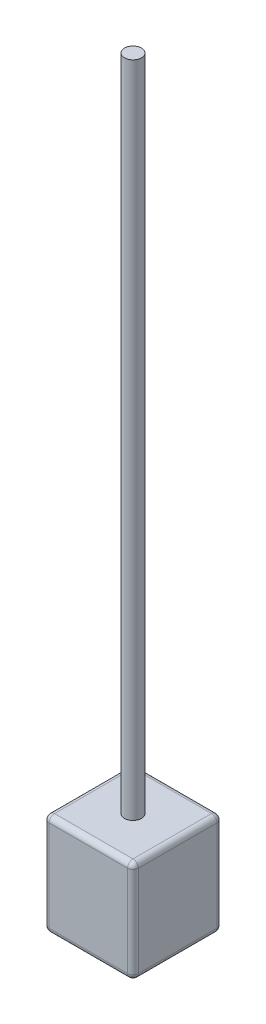
ISO-10303-21;
HEADER;
FILE_DESCRIPTION(('STEP AP214'),'2;1');
FILE_NAME('part.step','',(''),(''),'','','');
FILE_SCHEMA(('AUTOMOTIVE_DESIGN { 1 0 10303 214 1 1 1 1 }'));
ENDSEC;
DATA;
#1=APPLICATION_CONTEXT('core data for automotive mechanical design processes');
#2=APPLICATION_PROTOCOL_DEFINITION('international standard','automotive_design',2000,#1);
#3=PRODUCT_CONTEXT('',#1,'mechanical');
#4=PRODUCT('Part','Part','',(#3));
#5=PRODUCT_RELATED_PRODUCT_CATEGORY('part','',(#4));
#6=PRODUCT_DEFINITION_FORMATION('','',#4);
#7=PRODUCT_DEFINITION_CONTEXT('part definition',#1,'design');
#8=PRODUCT_DEFINITION('design','',#6,#7);
#9=PRODUCT_DEFINITION_SHAPE('','',#8);
#10=(LENGTH_UNIT() NAMED_UNIT(*) SI_UNIT(.MILLI.,.METRE.));
#11=(NAMED_UNIT(*) PLANE_ANGLE_UNIT() SI_UNIT($,.RADIAN.));
#12=(NAMED_UNIT(*) SI_UNIT($,.STERADIAN.) SOLID_ANGLE_UNIT());
#13=UNCERTAINTY_MEASURE_WITH_UNIT(LENGTH_MEASURE(1.E-05),#10,'distance_accuracy_value','');
#14=(GEOMETRIC_REPRESENTATION_CONTEXT(3) GLOBAL_UNCERTAINTY_ASSIGNED_CONTEXT((#13)) GLOBAL_UNIT_ASSIGNED_CONTEXT((#10,
#11,#12)) REPRESENTATION_CONTEXT('',''));
#15=CARTESIAN_POINT('',(0.,0.,0.));
#16=DIRECTION('',(0.,0.,1.));
#17=DIRECTION('',(1.,0.,0.));
#18=AXIS2_PLACEMENT_3D('',#15,#16,#17);
#19=CARTESIAN_POINT('',(21.,48.,21.));
#20=DIRECTION('',(-1.,0.,0.));
#21=DIRECTION('',(0.,0.,1.));
#22=AXIS2_PLACEMENT_3D('',#19,#20,#21);
#23=PLANE('',#22);
#24=DIRECTION('',(0.,-1.,0.));
#25=VECTOR('',#24,1.);
#26=CARTESIAN_POINT('',(21.,48.,18.46));
#27=LINE('',#26,#25);
#28=CARTESIAN_POINT('',(21.,45.46,18.46));
#29=VERTEX_POINT('',#28);
#30=CARTESIAN_POINT('',(21.,2.54,18.46));
#31=VERTEX_POINT('',#30);
#32=EDGE_CURVE('E186',#29,#31,#27,.T.);
#33=ORIENTED_EDGE('',*,*,#32,.T.);
#34=DIRECTION('',(0.,0.,-1.));
#35=VECTOR('',#34,1.);
#36=CARTESIAN_POINT('',(21.,2.54,-21.));
#37=LINE('',#36,#35);
#38=CARTESIAN_POINT('',(21.,2.54,-18.46));
#39=VERTEX_POINT('',#38);
#40=EDGE_CURVE('E190',#31,#39,#37,.T.);
#41=ORIENTED_EDGE('',*,*,#40,.T.);
#42=DIRECTION('',(0.,-1.,0.));
#43=VECTOR('',#42,1.);
#44=CARTESIAN_POINT('',(21.,48.,-18.46));
#45=LINE('',#44,#43);
#46=CARTESIAN_POINT('',(21.,45.46,-18.46));
#47=VERTEX_POINT('',#46);
#48=EDGE_CURVE('E188',#39,#47,#45,.F.);
#49=ORIENTED_EDGE('',*,*,#48,.T.);
#50=DIRECTION('',(0.,0.,-1.));
#51=VECTOR('',#50,1.);
#52=CARTESIAN_POINT('',(21.,45.46,21.));
#53=LINE('',#52,#51);
#54=EDGE_CURVE('E184',#47,#29,#53,.F.);
#55=ORIENTED_EDGE('',*,*,#54,.T.);
#56=EDGE_LOOP('',(#33,#41,#49,#55));
#57=FACE_BOUND('',#56,.T.);
#58=ADVANCED_FACE('F32',(#57),#23,.F.);
#59=CARTESIAN_POINT('',(-21.,48.,-21.));
#60=DIRECTION('',(0.,0.,1.));
#61=DIRECTION('',(1.,0.,0.));
#62=AXIS2_PLACEMENT_3D('',#59,#60,#61);
#63=PLANE('',#62);
#64=DIRECTION('',(-1.,0.,0.));
#65=VECTOR('',#64,1.);
#66=CARTESIAN_POINT('',(-21.,2.54,-21.));
#67=LINE('',#66,#65);
#68=CARTESIAN_POINT('',(18.46,2.54,-21.));
#69=VERTEX_POINT('',#68);
#70=CARTESIAN_POINT('',(-18.46,2.54,-21.));
#71=VERTEX_POINT('',#70);
#72=EDGE_CURVE('E170',#69,#71,#67,.T.);
#73=ORIENTED_EDGE('',*,*,#72,.T.);
#74=DIRECTION('',(0.,-1.,0.));
#75=VECTOR('',#74,1.);
#76=CARTESIAN_POINT('',(-18.46,48.,-21.));
#77=LINE('',#76,#75);
#78=CARTESIAN_POINT('',(-18.46,45.46,-21.));
#79=VERTEX_POINT('',#78);
#80=EDGE_CURVE('E172',#71,#79,#77,.F.);
#81=ORIENTED_EDGE('',*,*,#80,.T.);
#82=DIRECTION('',(-1.,0.,0.));
#83=VECTOR('',#82,1.);
#84=CARTESIAN_POINT('',(-21.,45.46,-21.));
#85=LINE('',#84,#83);
#86=CARTESIAN_POINT('',(18.46,45.46,-21.));
#87=VERTEX_POINT('',#86);
#88=EDGE_CURVE('E166',#79,#87,#85,.F.);
#89=ORIENTED_EDGE('',*,*,#88,.T.);
#90=DIRECTION('',(0.,-1.,0.));
#91=VECTOR('',#90,1.);
#92=CARTESIAN_POINT('',(18.46,48.,-21.));
#93=LINE('',#92,#91);
#94=EDGE_CURVE('E168',#87,#69,#93,.T.);
#95=ORIENTED_EDGE('',*,*,#94,.T.);
#96=EDGE_LOOP('',(#73,#81,#89,#95));
#97=FACE_BOUND('',#96,.T.);
#98=ADVANCED_FACE('F288',(#97),#63,.F.);
#99=CARTESIAN_POINT('',(-21.,48.,21.));
#100=DIRECTION('',(1.,0.,0.));
#101=DIRECTION('',(0.,0.,-1.));
#102=AXIS2_PLACEMENT_3D('',#99,#100,#101);
#103=PLANE('',#102);
#104=DIRECTION('',(0.,0.,1.));
#105=VECTOR('',#104,1.);
#106=CARTESIAN_POINT('',(-21.,45.46,21.));
#107=LINE('',#106,#105);
#108=CARTESIAN_POINT('',(-21.,45.46,18.46));
#109=VERTEX_POINT('',#108);
#110=CARTESIAN_POINT('',(-21.,45.46,-18.46));
#111=VERTEX_POINT('',#110);
#112=EDGE_CURVE('E125',#109,#111,#107,.F.);
#113=ORIENTED_EDGE('',*,*,#112,.T.);
#114=DIRECTION('',(0.,-1.,0.));
#115=VECTOR('',#114,1.);
#116=CARTESIAN_POINT('',(-21.,48.,-18.46));
#117=LINE('',#116,#115);
#118=CARTESIAN_POINT('',(-21.,2.54,-18.46));
#119=VERTEX_POINT('',#118);
#120=EDGE_CURVE('E164',#111,#119,#117,.T.);
#121=ORIENTED_EDGE('',*,*,#120,.T.);
#122=DIRECTION('',(0.,0.,1.));
#123=VECTOR('',#122,1.);
#124=CARTESIAN_POINT('',(-21.,2.54,21.));
#125=LINE('',#124,#123);
#126=CARTESIAN_POINT('',(-21.,2.54,18.46));
#127=VERTEX_POINT('',#126);
#128=EDGE_CURVE('E128',#119,#127,#125,.T.);
#129=ORIENTED_EDGE('',*,*,#128,.T.);
#130=DIRECTION('',(0.,-1.,0.));
#131=VECTOR('',#130,1.);
#132=CARTESIAN_POINT('',(-21.,48.,18.46));
#133=LINE('',#132,#131);
#134=EDGE_CURVE('E120',#127,#109,#133,.F.);
#135=ORIENTED_EDGE('',*,*,#134,.T.);
#136=EDGE_LOOP('',(#113,#121,#129,#135));
#137=FACE_BOUND('',#136,.T.);
#138=ADVANCED_FACE('F122',(#137),#103,.F.);
#139=CARTESIAN_POINT('',(-21.,48.,21.));
#140=DIRECTION('',(0.,0.,-1.));
#141=DIRECTION('',(-1.,0.,0.));
#142=AXIS2_PLACEMENT_3D('',#139,#140,#141);
#143=PLANE('',#142);
#144=DIRECTION('',(0.,-1.,0.));
#145=VECTOR('',#144,1.);
#146=CARTESIAN_POINT('',(-18.46,48.,21.));
#147=LINE('',#146,#145);
#148=CARTESIAN_POINT('',(-18.46,45.46,21.));
#149=VERTEX_POINT('',#148);
#150=CARTESIAN_POINT('',(-18.46,2.54,21.));
#151=VERTEX_POINT('',#150);
#152=EDGE_CURVE('E138',#149,#151,#147,.T.);
#153=ORIENTED_EDGE('',*,*,#152,.T.);
#154=DIRECTION('',(1.,0.,0.));
#155=VECTOR('',#154,1.);
#156=CARTESIAN_POINT('',(21.,2.54,21.));
#157=LINE('',#156,#155);
#158=CARTESIAN_POINT('',(18.46,2.54,21.));
#159=VERTEX_POINT('',#158);
#160=EDGE_CURVE('E198',#151,#159,#157,.T.);
#161=ORIENTED_EDGE('',*,*,#160,.T.);
#162=DIRECTION('',(0.,-1.,0.));
#163=VECTOR('',#162,1.);
#164=CARTESIAN_POINT('',(18.46,48.,21.));
#165=LINE('',#164,#163);
#166=CARTESIAN_POINT('',(18.46,45.46,21.));
#167=VERTEX_POINT('',#166);
#168=EDGE_CURVE('E195',#159,#167,#165,.F.);
#169=ORIENTED_EDGE('',*,*,#168,.T.);
#170=DIRECTION('',(1.,0.,0.));
#171=VECTOR('',#170,1.);
#172=CARTESIAN_POINT('',(-21.,45.46,21.));
#173=LINE('',#172,#171);
#174=EDGE_CURVE('E193',#167,#149,#173,.F.);
#175=ORIENTED_EDGE('',*,*,#174,.T.);
#176=EDGE_LOOP('',(#153,#161,#169,#175));
#177=FACE_BOUND('',#176,.T.);
#178=ADVANCED_FACE('F277',(#177),#143,.F.);
#179=CARTESIAN_POINT('',(0.,48.,0.));
#180=DIRECTION('',(0.,-1.,0.));
#181=DIRECTION('',(0.,0.,-1.));
#182=AXIS2_PLACEMENT_3D('',#179,#180,#181);
#183=PLANE('',#182);
#184=DIRECTION('',(-1.,0.,0.));
#185=VECTOR('',#184,1.);
#186=CARTESIAN_POINT('',(0.,48.,-18.46));
#187=LINE('',#186,#185);
#188=CARTESIAN_POINT('',(18.46,48.,-18.46));
#189=VERTEX_POINT('',#188);
#190=CARTESIAN_POINT('',(-18.46,48.,-18.46));
#191=VERTEX_POINT('',#190);
#192=EDGE_CURVE('E41',#189,#191,#187,.T.);
#193=ORIENTED_EDGE('',*,*,#192,.T.);
#194=DIRECTION('',(0.,0.,1.));
#195=VECTOR('',#194,1.);
#196=CARTESIAN_POINT('',(-18.46,48.,0.));
#197=LINE('',#196,#195);
#198=CARTESIAN_POINT('',(-18.46,48.,18.46));
#199=VERTEX_POINT('',#198);
#200=EDGE_CURVE('E11',#191,#199,#197,.T.);
#201=ORIENTED_EDGE('',*,*,#200,.T.);
#202=DIRECTION('',(1.,0.,0.));
#203=VECTOR('',#202,1.);
#204=CARTESIAN_POINT('',(0.,48.,18.46));
#205=LINE('',#204,#203);
#206=CARTESIAN_POINT('',(18.46,48.,18.46));
#207=VERTEX_POINT('',#206);
#208=EDGE_CURVE('E201',#199,#207,#205,.T.);
#209=ORIENTED_EDGE('',*,*,#208,.T.);
#210=DIRECTION('',(0.,0.,-1.));
#211=VECTOR('',#210,1.);
#212=CARTESIAN_POINT('',(18.46,48.,0.));
#213=LINE('',#212,#211);
#214=EDGE_CURVE('E52',#207,#189,#213,.T.);
#215=ORIENTED_EDGE('',*,*,#214,.T.);
#216=EDGE_LOOP('',(#193,#201,#209,#215));
#217=FACE_BOUND('',#216,.T.);
#218=CARTESIAN_POINT('',(0.,48.,0.));
#219=DIRECTION('',(0.,-1.,0.));
#220=DIRECTION('',(0.,0.,-1.));
#221=AXIS2_PLACEMENT_3D('',#218,#219,#220);
#222=CIRCLE('',#221,4.);
#223=CARTESIAN_POINT('',(0.,48.,-4.));
#224=VERTEX_POINT('',#223);
#225=EDGE_CURVE('E156',#224,#224,#222,.F.);
#226=ORIENTED_EDGE('',*,*,#225,.F.);
#227=EDGE_LOOP('',(#226));
#228=FACE_BOUND('',#227,.T.);
#229=ADVANCED_FACE('F275',(#217,#228),#183,.F.);
#230=CARTESIAN_POINT('',(0.,0.,0.));
#231=DIRECTION('',(0.,-1.,0.));
#232=DIRECTION('',(0.,0.,-1.));
#233=AXIS2_PLACEMENT_3D('',#230,#231,#232);
#234=PLANE('',#233);
#235=DIRECTION('',(0.,0.,1.));
#236=VECTOR('',#235,1.);
#237=CARTESIAN_POINT('',(-18.46,0.,-21.));
#238=LINE('',#237,#236);
#239=CARTESIAN_POINT('',(-18.46,0.,18.46));
#240=VERTEX_POINT('',#239);
#241=CARTESIAN_POINT('',(-18.46,0.,-18.46));
#242=VERTEX_POINT('',#241);
#243=EDGE_CURVE('E179',#240,#242,#238,.F.);
#244=ORIENTED_EDGE('',*,*,#243,.T.);
#245=DIRECTION('',(-1.,0.,0.));
#246=VECTOR('',#245,1.);
#247=CARTESIAN_POINT('',(21.,0.,-18.46));
#248=LINE('',#247,#246);
#249=CARTESIAN_POINT('',(18.46,0.,-18.46));
#250=VERTEX_POINT('',#249);
#251=EDGE_CURVE('E181',#242,#250,#248,.F.);
#252=ORIENTED_EDGE('',*,*,#251,.T.);
#253=DIRECTION('',(0.,0.,-1.));
#254=VECTOR('',#253,1.);
#255=CARTESIAN_POINT('',(18.46,0.,21.));
#256=LINE('',#255,#254);
#257=CARTESIAN_POINT('',(18.46,0.,18.46));
#258=VERTEX_POINT('',#257);
#259=EDGE_CURVE('E177',#250,#258,#256,.F.);
#260=ORIENTED_EDGE('',*,*,#259,.T.);
#261=DIRECTION('',(1.,0.,0.));
#262=VECTOR('',#261,1.);
#263=CARTESIAN_POINT('',(-21.,0.,18.46));
#264=LINE('',#263,#262);
#265=EDGE_CURVE('E175',#258,#240,#264,.F.);
#266=ORIENTED_EDGE('',*,*,#265,.T.);
#267=EDGE_LOOP('',(#244,#252,#260,#266));
#268=FACE_BOUND('',#267,.T.);
#269=ADVANCED_FACE('F271',(#268),#234,.T.);
#270=CARTESIAN_POINT('',(0.,358.,0.));
#271=DIRECTION('',(0.,-1.,0.));
#272=DIRECTION('',(0.,0.,-1.));
#273=AXIS2_PLACEMENT_3D('',#270,#271,#272);
#274=CYLINDRICAL_SURFACE('',#273,4.);
#275=CARTESIAN_POINT('',(0.,358.,0.));
#276=DIRECTION('',(0.,1.,0.));
#277=DIRECTION('',(0.,0.,1.));
#278=AXIS2_PLACEMENT_3D('',#275,#276,#277);
#279=CIRCLE('',#278,4.);
#280=CARTESIAN_POINT('',(0.,358.,4.));
#281=VERTEX_POINT('',#280);
#282=EDGE_CURVE('E159',#281,#281,#279,.T.);
#283=ORIENTED_EDGE('',*,*,#282,.F.);
#284=EDGE_LOOP('',(#283));
#285=FACE_BOUND('',#284,.T.);
#286=ORIENTED_EDGE('',*,*,#225,.T.);
#287=EDGE_LOOP('',(#286));
#288=FACE_BOUND('',#287,.T.);
#289=ADVANCED_FACE('F268',(#285,#288),#274,.T.);
#290=CARTESIAN_POINT('',(0.,358.,0.));
#291=DIRECTION('',(0.,1.,0.));
#292=DIRECTION('',(0.,0.,1.));
#293=AXIS2_PLACEMENT_3D('',#290,#291,#292);
#294=PLANE('',#293);
#295=ORIENTED_EDGE('',*,*,#282,.T.);
#296=EDGE_LOOP('',(#295));
#297=FACE_BOUND('',#296,.T.);
#298=ADVANCED_FACE('F266',(#297),#294,.T.);
#299=CARTESIAN_POINT('',(18.46,48.,18.46));
#300=DIRECTION('',(0.,-1.,0.));
#301=DIRECTION('',(0.,0.,-1.));
#302=AXIS2_PLACEMENT_3D('',#299,#300,#301);
#303=CYLINDRICAL_SURFACE('',#302,2.54);
#304=CARTESIAN_POINT('',(18.46,45.46,18.46));
#305=DIRECTION('',(0.,1.,0.));
#306=DIRECTION('',(0.,0.,1.));
#307=AXIS2_PLACEMENT_3D('',#304,#305,#306);
#308=CIRCLE('',#307,2.54);
#309=EDGE_CURVE('E36',#167,#29,#308,.T.);
#310=ORIENTED_EDGE('',*,*,#309,.F.);
#311=ORIENTED_EDGE('',*,*,#168,.F.);
#312=CARTESIAN_POINT('',(18.46,2.54,18.46));
#313=DIRECTION('',(0.,-1.,0.));
#314=DIRECTION('',(0.,0.,-1.));
#315=AXIS2_PLACEMENT_3D('',#312,#313,#314);
#316=CIRCLE('',#315,2.54);
#317=EDGE_CURVE('E251',#31,#159,#316,.T.);
#318=ORIENTED_EDGE('',*,*,#317,.F.);
#319=ORIENTED_EDGE('',*,*,#32,.F.);
#320=EDGE_LOOP('',(#310,#311,#318,#319));
#321=FACE_BOUND('',#320,.T.);
#322=ADVANCED_FACE('F34',(#321),#303,.T.);
#323=CARTESIAN_POINT('',(18.46,45.46,18.46));
#324=DIRECTION('',(0.,0.,1.));
#325=DIRECTION('',(1.,0.,0.));
#326=AXIS2_PLACEMENT_3D('',#323,#324,#325);
#327=SPHERICAL_SURFACE('',#326,2.54);
#328=CARTESIAN_POINT('',(18.46,45.46,18.46));
#329=DIRECTION('',(1.,0.,0.));
#330=DIRECTION('',(0.,0.,-1.));
#331=AXIS2_PLACEMENT_3D('',#328,#329,#330);
#332=CIRCLE('',#331,2.54);
#333=EDGE_CURVE('E246',#167,#207,#332,.F.);
#334=ORIENTED_EDGE('',*,*,#333,.F.);
#335=ORIENTED_EDGE('',*,*,#309,.T.);
#336=CARTESIAN_POINT('',(18.46,45.46,18.46));
#337=DIRECTION('',(0.,0.,1.));
#338=DIRECTION('',(1.,0.,0.));
#339=AXIS2_PLACEMENT_3D('',#336,#337,#338);
#340=CIRCLE('',#339,2.54);
#341=EDGE_CURVE('E249',#207,#29,#340,.F.);
#342=ORIENTED_EDGE('',*,*,#341,.F.);
#343=EDGE_LOOP('',(#334,#335,#342));
#344=FACE_BOUND('',#343,.T.);
#345=ADVANCED_FACE('F362',(#344),#327,.T.);
#346=CARTESIAN_POINT('',(18.46,2.54,18.46));
#347=DIRECTION('',(0.,0.,1.));
#348=DIRECTION('',(1.,0.,0.));
#349=AXIS2_PLACEMENT_3D('',#346,#347,#348);
#350=SPHERICAL_SURFACE('',#349,2.54);
#351=CARTESIAN_POINT('',(18.46,2.54,18.46));
#352=DIRECTION('',(0.,0.,1.));
#353=DIRECTION('',(1.,0.,0.));
#354=AXIS2_PLACEMENT_3D('',#351,#352,#353);
#355=CIRCLE('',#354,2.54);
#356=EDGE_CURVE('E241',#31,#258,#355,.F.);
#357=ORIENTED_EDGE('',*,*,#356,.F.);
#358=ORIENTED_EDGE('',*,*,#317,.T.);
#359=CARTESIAN_POINT('',(18.46,2.54,18.46));
#360=DIRECTION('',(1.,0.,0.));
#361=DIRECTION('',(0.,0.,-1.));
#362=AXIS2_PLACEMENT_3D('',#359,#360,#361);
#363=CIRCLE('',#362,2.54);
#364=EDGE_CURVE('E244',#258,#159,#363,.F.);
#365=ORIENTED_EDGE('',*,*,#364,.F.);
#366=EDGE_LOOP('',(#357,#358,#365));
#367=FACE_BOUND('',#366,.T.);
#368=ADVANCED_FACE('F359',(#367),#350,.T.);
#369=CARTESIAN_POINT('',(18.46,45.46,0.));
#370=DIRECTION('',(0.,0.,-1.));
#371=DIRECTION('',(-1.,0.,0.));
#372=AXIS2_PLACEMENT_3D('',#369,#370,#371);
#373=CYLINDRICAL_SURFACE('',#372,2.54);
#374=ORIENTED_EDGE('',*,*,#341,.T.);
#375=ORIENTED_EDGE('',*,*,#54,.F.);
#376=CARTESIAN_POINT('',(18.46,45.46,-18.46));
#377=DIRECTION('',(0.,0.,-1.));
#378=DIRECTION('',(-1.,0.,0.));
#379=AXIS2_PLACEMENT_3D('',#376,#377,#378);
#380=CIRCLE('',#379,2.54);
#381=EDGE_CURVE('E235',#189,#47,#380,.T.);
#382=ORIENTED_EDGE('',*,*,#381,.F.);
#383=ORIENTED_EDGE('',*,*,#214,.F.);
#384=EDGE_LOOP('',(#374,#375,#382,#383));
#385=FACE_BOUND('',#384,.T.);
#386=ADVANCED_FACE('F355',(#385),#373,.T.);
#387=CARTESIAN_POINT('',(0.,45.46,18.46));
#388=DIRECTION('',(1.,0.,0.));
#389=DIRECTION('',(0.,0.,-1.));
#390=AXIS2_PLACEMENT_3D('',#387,#388,#389);
#391=CYLINDRICAL_SURFACE('',#390,2.54);
#392=ORIENTED_EDGE('',*,*,#333,.T.);
#393=ORIENTED_EDGE('',*,*,#208,.F.);
#394=CARTESIAN_POINT('',(-18.46,45.46,18.46));
#395=DIRECTION('',(-1.,0.,0.));
#396=DIRECTION('',(0.,0.,1.));
#397=AXIS2_PLACEMENT_3D('',#394,#395,#396);
#398=CIRCLE('',#397,2.54);
#399=EDGE_CURVE('E142',#149,#199,#398,.T.);
#400=ORIENTED_EDGE('',*,*,#399,.F.);
#401=ORIENTED_EDGE('',*,*,#174,.F.);
#402=EDGE_LOOP('',(#392,#393,#400,#401));
#403=FACE_BOUND('',#402,.T.);
#404=ADVANCED_FACE('F352',(#403),#391,.T.);
#405=CARTESIAN_POINT('',(-18.46,48.,18.46));
#406=DIRECTION('',(0.,-1.,0.));
#407=DIRECTION('',(0.,0.,-1.));
#408=AXIS2_PLACEMENT_3D('',#405,#406,#407);
#409=CYLINDRICAL_SURFACE('',#408,2.54);
#410=CARTESIAN_POINT('',(-18.46,2.54,18.46));
#411=DIRECTION('',(0.,-1.,0.));
#412=DIRECTION('',(0.,0.,-1.));
#413=AXIS2_PLACEMENT_3D('',#410,#411,#412);
#414=CIRCLE('',#413,2.54);
#415=EDGE_CURVE('E143',#151,#127,#414,.T.);
#416=ORIENTED_EDGE('',*,*,#415,.F.);
#417=ORIENTED_EDGE('',*,*,#152,.F.);
#418=CARTESIAN_POINT('',(-18.46,45.46,18.46));
#419=DIRECTION('',(0.,1.,0.));
#420=DIRECTION('',(0.,0.,1.));
#421=AXIS2_PLACEMENT_3D('',#418,#419,#420);
#422=CIRCLE('',#421,2.54);
#423=EDGE_CURVE('E135',#109,#149,#422,.T.);
#424=ORIENTED_EDGE('',*,*,#423,.F.);
#425=ORIENTED_EDGE('',*,*,#134,.F.);
#426=EDGE_LOOP('',(#416,#417,#424,#425));
#427=FACE_BOUND('',#426,.T.);
#428=ADVANCED_FACE('F137',(#427),#409,.T.);
#429=CARTESIAN_POINT('',(-21.,2.54,18.46));
#430=DIRECTION('',(-1.,0.,0.));
#431=DIRECTION('',(0.,0.,1.));
#432=AXIS2_PLACEMENT_3D('',#429,#430,#431);
#433=CYLINDRICAL_SURFACE('',#432,2.54);
#434=ORIENTED_EDGE('',*,*,#364,.T.);
#435=ORIENTED_EDGE('',*,*,#160,.F.);
#436=CARTESIAN_POINT('',(-18.46,2.54,18.46));
#437=DIRECTION('',(-1.,0.,0.));
#438=DIRECTION('',(0.,0.,1.));
#439=AXIS2_PLACEMENT_3D('',#436,#437,#438);
#440=CIRCLE('',#439,2.54);
#441=EDGE_CURVE('E230',#240,#151,#440,.T.);
#442=ORIENTED_EDGE('',*,*,#441,.F.);
#443=ORIENTED_EDGE('',*,*,#265,.F.);
#444=EDGE_LOOP('',(#434,#435,#442,#443));
#445=FACE_BOUND('',#444,.T.);
#446=ADVANCED_FACE('F345',(#445),#433,.T.);
#447=CARTESIAN_POINT('',(18.46,2.54,21.));
#448=DIRECTION('',(0.,0.,1.));
#449=DIRECTION('',(1.,0.,0.));
#450=AXIS2_PLACEMENT_3D('',#447,#448,#449);
#451=CYLINDRICAL_SURFACE('',#450,2.54);
#452=ORIENTED_EDGE('',*,*,#356,.T.);
#453=ORIENTED_EDGE('',*,*,#259,.F.);
#454=CARTESIAN_POINT('',(18.46,2.54,-18.46));
#455=DIRECTION('',(0.,0.,-1.));
#456=DIRECTION('',(-1.,0.,0.));
#457=AXIS2_PLACEMENT_3D('',#454,#455,#456);
#458=CIRCLE('',#457,2.54);
#459=EDGE_CURVE('E227',#39,#250,#458,.T.);
#460=ORIENTED_EDGE('',*,*,#459,.F.);
#461=ORIENTED_EDGE('',*,*,#40,.F.);
#462=EDGE_LOOP('',(#452,#453,#460,#461));
#463=FACE_BOUND('',#462,.T.);
#464=ADVANCED_FACE('F341',(#463),#451,.T.);
#465=CARTESIAN_POINT('',(18.46,48.,-18.46));
#466=DIRECTION('',(0.,-1.,0.));
#467=DIRECTION('',(0.,0.,-1.));
#468=AXIS2_PLACEMENT_3D('',#465,#466,#467);
#469=CYLINDRICAL_SURFACE('',#468,2.54);
#470=CARTESIAN_POINT('',(18.46,45.46,-18.46));
#471=DIRECTION('',(0.,1.,0.));
#472=DIRECTION('',(0.,0.,1.));
#473=AXIS2_PLACEMENT_3D('',#470,#471,#472);
#474=CIRCLE('',#473,2.54);
#475=EDGE_CURVE('E238',#47,#87,#474,.T.);
#476=ORIENTED_EDGE('',*,*,#475,.F.);
#477=ORIENTED_EDGE('',*,*,#48,.F.);
#478=CARTESIAN_POINT('',(18.46,2.54,-18.46));
#479=DIRECTION('',(0.,-1.,0.));
#480=DIRECTION('',(0.,0.,-1.));
#481=AXIS2_PLACEMENT_3D('',#478,#479,#480);
#482=CIRCLE('',#481,2.54);
#483=EDGE_CURVE('E225',#69,#39,#482,.T.);
#484=ORIENTED_EDGE('',*,*,#483,.F.);
#485=ORIENTED_EDGE('',*,*,#94,.F.);
#486=EDGE_LOOP('',(#476,#477,#484,#485));
#487=FACE_BOUND('',#486,.T.);
#488=ADVANCED_FACE('F337',(#487),#469,.T.);
#489=CARTESIAN_POINT('',(18.46,45.46,-18.46));
#490=DIRECTION('',(0.,0.,1.));
#491=DIRECTION('',(1.,0.,0.));
#492=AXIS2_PLACEMENT_3D('',#489,#490,#491);
#493=SPHERICAL_SURFACE('',#492,2.54);
#494=ORIENTED_EDGE('',*,*,#381,.T.);
#495=ORIENTED_EDGE('',*,*,#475,.T.);
#496=CARTESIAN_POINT('',(18.46,45.46,-18.46));
#497=DIRECTION('',(1.,0.,0.));
#498=DIRECTION('',(0.,0.,-1.));
#499=AXIS2_PLACEMENT_3D('',#496,#497,#498);
#500=CIRCLE('',#499,2.54);
#501=EDGE_CURVE('E149',#189,#87,#500,.F.);
#502=ORIENTED_EDGE('',*,*,#501,.F.);
#503=EDGE_LOOP('',(#494,#495,#502));
#504=FACE_BOUND('',#503,.T.);
#505=ADVANCED_FACE('F334',(#504),#493,.T.);
#506=CARTESIAN_POINT('',(-18.46,45.46,18.46));
#507=DIRECTION('',(0.,0.,1.));
#508=DIRECTION('',(1.,0.,0.));
#509=AXIS2_PLACEMENT_3D('',#506,#507,#508);
#510=SPHERICAL_SURFACE('',#509,2.54);
#511=ORIENTED_EDGE('',*,*,#423,.T.);
#512=ORIENTED_EDGE('',*,*,#399,.T.);
#513=CARTESIAN_POINT('',(-18.46,45.46,18.46));
#514=DIRECTION('',(0.,0.,1.));
#515=DIRECTION('',(1.,0.,0.));
#516=AXIS2_PLACEMENT_3D('',#513,#514,#515);
#517=CIRCLE('',#516,2.54);
#518=EDGE_CURVE('E145',#109,#199,#517,.F.);
#519=ORIENTED_EDGE('',*,*,#518,.F.);
#520=EDGE_LOOP('',(#511,#512,#519));
#521=FACE_BOUND('',#520,.T.);
#522=ADVANCED_FACE('F146',(#521),#510,.T.);
#523=CARTESIAN_POINT('',(-18.46,2.54,18.46));
#524=DIRECTION('',(0.,0.,1.));
#525=DIRECTION('',(1.,0.,0.));
#526=AXIS2_PLACEMENT_3D('',#523,#524,#525);
#527=SPHERICAL_SURFACE('',#526,2.54);
#528=ORIENTED_EDGE('',*,*,#441,.T.);
#529=ORIENTED_EDGE('',*,*,#415,.T.);
#530=CARTESIAN_POINT('',(-18.46,2.54,18.46));
#531=DIRECTION('',(0.,0.,1.));
#532=DIRECTION('',(1.,0.,0.));
#533=AXIS2_PLACEMENT_3D('',#530,#531,#532);
#534=CIRCLE('',#533,2.54);
#535=EDGE_CURVE('E150',#240,#127,#534,.F.);
#536=ORIENTED_EDGE('',*,*,#535,.F.);
#537=EDGE_LOOP('',(#528,#529,#536));
#538=FACE_BOUND('',#537,.T.);
#539=ADVANCED_FACE('F327',(#538),#527,.T.);
#540=CARTESIAN_POINT('',(18.46,2.54,-18.46));
#541=DIRECTION('',(0.,0.,1.));
#542=DIRECTION('',(1.,0.,0.));
#543=AXIS2_PLACEMENT_3D('',#540,#541,#542);
#544=SPHERICAL_SURFACE('',#543,2.54);
#545=ORIENTED_EDGE('',*,*,#483,.T.);
#546=ORIENTED_EDGE('',*,*,#459,.T.);
#547=CARTESIAN_POINT('',(18.46,2.54,-18.46));
#548=DIRECTION('',(1.,0.,0.));
#549=DIRECTION('',(0.,0.,-1.));
#550=AXIS2_PLACEMENT_3D('',#547,#548,#549);
#551=CIRCLE('',#550,2.54);
#552=EDGE_CURVE('E219',#69,#250,#551,.F.);
#553=ORIENTED_EDGE('',*,*,#552,.F.);
#554=EDGE_LOOP('',(#545,#546,#553));
#555=FACE_BOUND('',#554,.T.);
#556=ADVANCED_FACE('F323',(#555),#544,.T.);
#557=CARTESIAN_POINT('',(0.,45.46,-18.46));
#558=DIRECTION('',(-1.,0.,0.));
#559=DIRECTION('',(0.,0.,1.));
#560=AXIS2_PLACEMENT_3D('',#557,#558,#559);
#561=CYLINDRICAL_SURFACE('',#560,2.54);
#562=ORIENTED_EDGE('',*,*,#501,.T.);
#563=ORIENTED_EDGE('',*,*,#88,.F.);
#564=CARTESIAN_POINT('',(-18.46,45.46,-18.46));
#565=DIRECTION('',(-1.,0.,0.));
#566=DIRECTION('',(0.,0.,1.));
#567=AXIS2_PLACEMENT_3D('',#564,#565,#566);
#568=CIRCLE('',#567,2.54);
#569=EDGE_CURVE('E216',#191,#79,#568,.T.);
#570=ORIENTED_EDGE('',*,*,#569,.F.);
#571=ORIENTED_EDGE('',*,*,#192,.F.);
#572=EDGE_LOOP('',(#562,#563,#570,#571));
#573=FACE_BOUND('',#572,.T.);
#574=ADVANCED_FACE('F320',(#573),#561,.T.);
#575=CARTESIAN_POINT('',(-18.46,45.46,0.));
#576=DIRECTION('',(0.,0.,1.));
#577=DIRECTION('',(1.,0.,0.));
#578=AXIS2_PLACEMENT_3D('',#575,#576,#577);
#579=CYLINDRICAL_SURFACE('',#578,2.54);
#580=ORIENTED_EDGE('',*,*,#518,.T.);
#581=ORIENTED_EDGE('',*,*,#200,.F.);
#582=CARTESIAN_POINT('',(-18.46,45.46,-18.46));
#583=DIRECTION('',(0.,0.,-1.));
#584=DIRECTION('',(-1.,0.,0.));
#585=AXIS2_PLACEMENT_3D('',#582,#583,#584);
#586=CIRCLE('',#585,2.54);
#587=EDGE_CURVE('E154',#111,#191,#586,.T.);
#588=ORIENTED_EDGE('',*,*,#587,.F.);
#589=ORIENTED_EDGE('',*,*,#112,.F.);
#590=EDGE_LOOP('',(#580,#581,#588,#589));
#591=FACE_BOUND('',#590,.T.);
#592=ADVANCED_FACE('F152',(#591),#579,.T.);
#593=CARTESIAN_POINT('',(-18.46,2.54,21.));
#594=DIRECTION('',(0.,0.,-1.));
#595=DIRECTION('',(-1.,0.,0.));
#596=AXIS2_PLACEMENT_3D('',#593,#594,#595);
#597=CYLINDRICAL_SURFACE('',#596,2.54);
#598=ORIENTED_EDGE('',*,*,#535,.T.);
#599=ORIENTED_EDGE('',*,*,#128,.F.);
#600=CARTESIAN_POINT('',(-18.46,2.54,-18.46));
#601=DIRECTION('',(0.,0.,-1.));
#602=DIRECTION('',(-1.,0.,0.));
#603=AXIS2_PLACEMENT_3D('',#600,#601,#602);
#604=CIRCLE('',#603,2.54);
#605=EDGE_CURVE('E212',#242,#119,#604,.T.);
#606=ORIENTED_EDGE('',*,*,#605,.F.);
#607=ORIENTED_EDGE('',*,*,#243,.F.);
#608=EDGE_LOOP('',(#598,#599,#606,#607));
#609=FACE_BOUND('',#608,.T.);
#610=ADVANCED_FACE('F313',(#609),#597,.T.);
#611=CARTESIAN_POINT('',(-21.,2.54,-18.46));
#612=DIRECTION('',(1.,0.,0.));
#613=DIRECTION('',(0.,0.,-1.));
#614=AXIS2_PLACEMENT_3D('',#611,#612,#613);
#615=CYLINDRICAL_SURFACE('',#614,2.54);
#616=ORIENTED_EDGE('',*,*,#552,.T.);
#617=ORIENTED_EDGE('',*,*,#251,.F.);
#618=CARTESIAN_POINT('',(-18.46,2.54,-18.46));
#619=DIRECTION('',(-1.,0.,0.));
#620=DIRECTION('',(0.,0.,1.));
#621=AXIS2_PLACEMENT_3D('',#618,#619,#620);
#622=CIRCLE('',#621,2.54);
#623=EDGE_CURVE('E209',#71,#242,#622,.T.);
#624=ORIENTED_EDGE('',*,*,#623,.F.);
#625=ORIENTED_EDGE('',*,*,#72,.F.);
#626=EDGE_LOOP('',(#616,#617,#624,#625));
#627=FACE_BOUND('',#626,.T.);
#628=ADVANCED_FACE('F309',(#627),#615,.T.);
#629=CARTESIAN_POINT('',(-18.46,45.46,-18.46));
#630=DIRECTION('',(0.,0.,1.));
#631=DIRECTION('',(1.,0.,0.));
#632=AXIS2_PLACEMENT_3D('',#629,#630,#631);
#633=SPHERICAL_SURFACE('',#632,2.54);
#634=ORIENTED_EDGE('',*,*,#587,.T.);
#635=ORIENTED_EDGE('',*,*,#569,.T.);
#636=CARTESIAN_POINT('',(-18.46,45.46,-18.46));
#637=DIRECTION('',(0.,1.,0.));
#638=DIRECTION('',(0.,0.,1.));
#639=AXIS2_PLACEMENT_3D('',#636,#637,#638);
#640=CIRCLE('',#639,2.54);
#641=EDGE_CURVE('E207',#111,#79,#640,.F.);
#642=ORIENTED_EDGE('',*,*,#641,.F.);
#643=EDGE_LOOP('',(#634,#635,#642));
#644=FACE_BOUND('',#643,.T.);
#645=ADVANCED_FACE('F305',(#644),#633,.T.);
#646=CARTESIAN_POINT('',(-18.46,2.54,-18.46));
#647=DIRECTION('',(0.,0.,1.));
#648=DIRECTION('',(1.,0.,0.));
#649=AXIS2_PLACEMENT_3D('',#646,#647,#648);
#650=SPHERICAL_SURFACE('',#649,2.54);
#651=ORIENTED_EDGE('',*,*,#623,.T.);
#652=ORIENTED_EDGE('',*,*,#605,.T.);
#653=CARTESIAN_POINT('',(-18.46,2.54,-18.46));
#654=DIRECTION('',(0.,-1.,0.));
#655=DIRECTION('',(0.,0.,-1.));
#656=AXIS2_PLACEMENT_3D('',#653,#654,#655);
#657=CIRCLE('',#656,2.54);
#658=EDGE_CURVE('E205',#71,#119,#657,.F.);
#659=ORIENTED_EDGE('',*,*,#658,.F.);
#660=EDGE_LOOP('',(#651,#652,#659));
#661=FACE_BOUND('',#660,.T.);
#662=ADVANCED_FACE('F301',(#661),#650,.T.);
#663=CARTESIAN_POINT('',(-18.46,48.,-18.46));
#664=DIRECTION('',(0.,-1.,0.));
#665=DIRECTION('',(0.,0.,-1.));
#666=AXIS2_PLACEMENT_3D('',#663,#664,#665);
#667=CYLINDRICAL_SURFACE('',#666,2.54);
#668=ORIENTED_EDGE('',*,*,#641,.T.);
#669=ORIENTED_EDGE('',*,*,#80,.F.);
#670=ORIENTED_EDGE('',*,*,#658,.T.);
#671=ORIENTED_EDGE('',*,*,#120,.F.);
#672=EDGE_LOOP('',(#668,#669,#670,#671));
#673=FACE_BOUND('',#672,.T.);
#674=ADVANCED_FACE('F298',(#673),#667,.T.);
#675=CLOSED_SHELL('',(#58,#98,#138,#178,#229,#269,#289,#298,#322,#345,#368,#386,#404,#428,#446,
#464,#488,#505,#522,#539,#556,#574,#592,#610,#628,#645,#662,#674));
#676=MANIFOLD_SOLID_BREP('B2',#675);
#677=ADVANCED_BREP_SHAPE_REPRESENTATION('',(#18,#676),#14);
#678=SHAPE_DEFINITION_REPRESENTATION(#9,#677);
ENDSEC;
END-ISO-10303-21;
